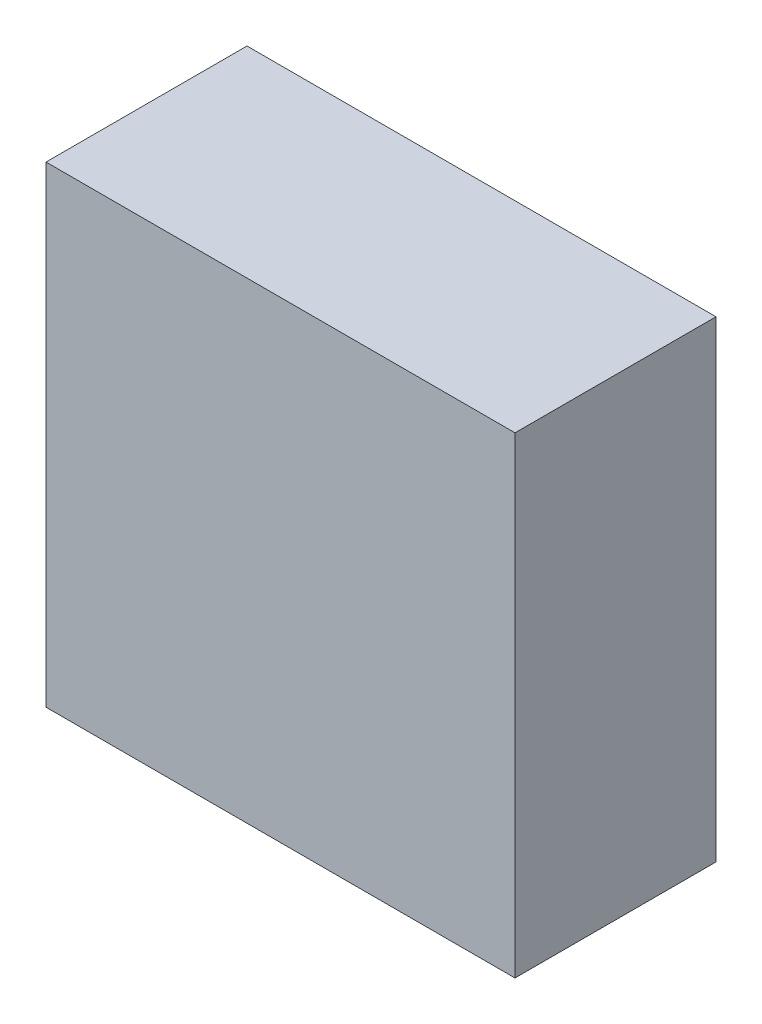
ISO-10303-21;
HEADER;
FILE_DESCRIPTION(('STEP AP214'),'2;1');
FILE_NAME('part.step','',(''),(''),'','','');
FILE_SCHEMA(('AUTOMOTIVE_DESIGN { 1 0 10303 214 1 1 1 1 }'));
ENDSEC;
DATA;
#1=APPLICATION_CONTEXT('core data for automotive mechanical design processes');
#2=APPLICATION_PROTOCOL_DEFINITION('international standard','automotive_design',2000,#1);
#3=PRODUCT_CONTEXT('',#1,'mechanical');
#4=PRODUCT('Part','Part','',(#3));
#5=PRODUCT_RELATED_PRODUCT_CATEGORY('part','',(#4));
#6=PRODUCT_DEFINITION_FORMATION('','',#4);
#7=PRODUCT_DEFINITION_CONTEXT('part definition',#1,'design');
#8=PRODUCT_DEFINITION('design','',#6,#7);
#9=PRODUCT_DEFINITION_SHAPE('','',#8);
#10=(LENGTH_UNIT() NAMED_UNIT(*) SI_UNIT(.MILLI.,.METRE.));
#11=(NAMED_UNIT(*) PLANE_ANGLE_UNIT() SI_UNIT($,.RADIAN.));
#12=(NAMED_UNIT(*) SI_UNIT($,.STERADIAN.) SOLID_ANGLE_UNIT());
#13=UNCERTAINTY_MEASURE_WITH_UNIT(LENGTH_MEASURE(1.E-05),#10,'distance_accuracy_value','');
#14=(GEOMETRIC_REPRESENTATION_CONTEXT(3) GLOBAL_UNCERTAINTY_ASSIGNED_CONTEXT((#13)) GLOBAL_UNIT_ASSIGNED_CONTEXT((#10,
#11,#12)) REPRESENTATION_CONTEXT('',''));
#15=CARTESIAN_POINT('',(0.,0.,0.));
#16=DIRECTION('',(0.,0.,1.));
#17=DIRECTION('',(1.,0.,0.));
#18=AXIS2_PLACEMENT_3D('',#15,#16,#17);
#19=CARTESIAN_POINT('',(-44.45,89.5,-19.05));
#20=DIRECTION('',(1.,0.,0.));
#21=DIRECTION('',(0.,0.,-1.));
#22=AXIS2_PLACEMENT_3D('',#19,#20,#21);
#23=PLANE('',#22);
#24=DIRECTION('',(0.,0.,1.));
#25=VECTOR('',#24,1.);
#26=CARTESIAN_POINT('',(-44.45,0.,-19.05));
#27=LINE('',#26,#25);
#28=CARTESIAN_POINT('',(-44.45,0.,-19.05));
#29=VERTEX_POINT('',#28);
#30=CARTESIAN_POINT('',(-44.45,0.,19.05));
#31=VERTEX_POINT('',#30);
#32=EDGE_CURVE('E106',#29,#31,#27,.T.);
#33=ORIENTED_EDGE('',*,*,#32,.T.);
#34=DIRECTION('',(0.,-1.,0.));
#35=VECTOR('',#34,1.);
#36=CARTESIAN_POINT('',(-44.45,89.5,19.05));
#37=LINE('',#36,#35);
#38=CARTESIAN_POINT('',(-44.45,89.5,19.05));
#39=VERTEX_POINT('',#38);
#40=EDGE_CURVE('E11',#39,#31,#37,.T.);
#41=ORIENTED_EDGE('',*,*,#40,.F.);
#42=DIRECTION('',(0.,0.,1.));
#43=VECTOR('',#42,1.);
#44=CARTESIAN_POINT('',(-44.45,89.5,-19.05));
#45=LINE('',#44,#43);
#46=CARTESIAN_POINT('',(-44.45,89.5,-19.05));
#47=VERTEX_POINT('',#46);
#48=EDGE_CURVE('E94',#47,#39,#45,.T.);
#49=ORIENTED_EDGE('',*,*,#48,.F.);
#50=DIRECTION('',(0.,-1.,0.));
#51=VECTOR('',#50,1.);
#52=CARTESIAN_POINT('',(-44.45,89.5,-19.05));
#53=LINE('',#52,#51);
#54=EDGE_CURVE('E102',#47,#29,#53,.T.);
#55=ORIENTED_EDGE('',*,*,#54,.T.);
#56=EDGE_LOOP('',(#33,#41,#49,#55));
#57=FACE_BOUND('',#56,.T.);
#58=ADVANCED_FACE('F43',(#57),#23,.F.);
#59=CARTESIAN_POINT('',(-44.45,89.5,19.05));
#60=DIRECTION('',(0.,0.,-1.));
#61=DIRECTION('',(-1.,0.,0.));
#62=AXIS2_PLACEMENT_3D('',#59,#60,#61);
#63=PLANE('',#62);
#64=DIRECTION('',(1.,0.,0.));
#65=VECTOR('',#64,1.);
#66=CARTESIAN_POINT('',(-44.45,0.,19.05));
#67=LINE('',#66,#65);
#68=CARTESIAN_POINT('',(44.45,0.,19.05));
#69=VERTEX_POINT('',#68);
#70=EDGE_CURVE('E98',#31,#69,#67,.T.);
#71=ORIENTED_EDGE('',*,*,#70,.T.);
#72=DIRECTION('',(0.,-1.,0.));
#73=VECTOR('',#72,1.);
#74=CARTESIAN_POINT('',(44.45,89.5,19.05));
#75=LINE('',#74,#73);
#76=CARTESIAN_POINT('',(44.45,89.5,19.05));
#77=VERTEX_POINT('',#76);
#78=EDGE_CURVE('E51',#77,#69,#75,.T.);
#79=ORIENTED_EDGE('',*,*,#78,.F.);
#80=DIRECTION('',(1.,0.,0.));
#81=VECTOR('',#80,1.);
#82=CARTESIAN_POINT('',(-44.45,89.5,19.05));
#83=LINE('',#82,#81);
#84=EDGE_CURVE('E89',#39,#77,#83,.T.);
#85=ORIENTED_EDGE('',*,*,#84,.F.);
#86=ORIENTED_EDGE('',*,*,#40,.T.);
#87=EDGE_LOOP('',(#71,#79,#85,#86));
#88=FACE_BOUND('',#87,.T.);
#89=ADVANCED_FACE('F97',(#88),#63,.F.);
#90=CARTESIAN_POINT('',(44.45,89.5,-19.05));
#91=DIRECTION('',(-1.,0.,0.));
#92=DIRECTION('',(0.,0.,1.));
#93=AXIS2_PLACEMENT_3D('',#90,#91,#92);
#94=PLANE('',#93);
#95=DIRECTION('',(0.,0.,-1.));
#96=VECTOR('',#95,1.);
#97=CARTESIAN_POINT('',(44.45,0.,-19.05));
#98=LINE('',#97,#96);
#99=CARTESIAN_POINT('',(44.45,0.,-19.05));
#100=VERTEX_POINT('',#99);
#101=EDGE_CURVE('E76',#69,#100,#98,.T.);
#102=ORIENTED_EDGE('',*,*,#101,.T.);
#103=DIRECTION('',(0.,-1.,0.));
#104=VECTOR('',#103,1.);
#105=CARTESIAN_POINT('',(44.45,89.5,-19.05));
#106=LINE('',#105,#104);
#107=CARTESIAN_POINT('',(44.45,89.5,-19.05));
#108=VERTEX_POINT('',#107);
#109=EDGE_CURVE('E99',#108,#100,#106,.T.);
#110=ORIENTED_EDGE('',*,*,#109,.F.);
#111=DIRECTION('',(0.,0.,-1.));
#112=VECTOR('',#111,1.);
#113=CARTESIAN_POINT('',(44.45,89.5,-19.05));
#114=LINE('',#113,#112);
#115=EDGE_CURVE('E92',#77,#108,#114,.T.);
#116=ORIENTED_EDGE('',*,*,#115,.F.);
#117=ORIENTED_EDGE('',*,*,#78,.T.);
#118=EDGE_LOOP('',(#102,#110,#116,#117));
#119=FACE_BOUND('',#118,.T.);
#120=ADVANCED_FACE('F100',(#119),#94,.F.);
#121=CARTESIAN_POINT('',(-44.45,89.5,-19.05));
#122=DIRECTION('',(0.,0.,1.));
#123=DIRECTION('',(1.,0.,0.));
#124=AXIS2_PLACEMENT_3D('',#121,#122,#123);
#125=PLANE('',#124);
#126=DIRECTION('',(-1.,0.,0.));
#127=VECTOR('',#126,1.);
#128=CARTESIAN_POINT('',(-44.45,0.,-19.05));
#129=LINE('',#128,#127);
#130=EDGE_CURVE('E82',#100,#29,#129,.T.);
#131=ORIENTED_EDGE('',*,*,#130,.T.);
#132=ORIENTED_EDGE('',*,*,#54,.F.);
#133=DIRECTION('',(-1.,0.,0.));
#134=VECTOR('',#133,1.);
#135=CARTESIAN_POINT('',(-44.45,89.5,-19.05));
#136=LINE('',#135,#134);
#137=EDGE_CURVE('E59',#108,#47,#136,.T.);
#138=ORIENTED_EDGE('',*,*,#137,.F.);
#139=ORIENTED_EDGE('',*,*,#109,.T.);
#140=EDGE_LOOP('',(#131,#132,#138,#139));
#141=FACE_BOUND('',#140,.T.);
#142=ADVANCED_FACE('F113',(#141),#125,.F.);
#143=CARTESIAN_POINT('',(0.,89.5,0.));
#144=DIRECTION('',(0.,1.,0.));
#145=DIRECTION('',(0.,0.,1.));
#146=AXIS2_PLACEMENT_3D('',#143,#144,#145);
#147=PLANE('',#146);
#148=ORIENTED_EDGE('',*,*,#48,.T.);
#149=ORIENTED_EDGE('',*,*,#84,.T.);
#150=ORIENTED_EDGE('',*,*,#115,.T.);
#151=ORIENTED_EDGE('',*,*,#137,.T.);
#152=EDGE_LOOP('',(#148,#149,#150,#151));
#153=FACE_BOUND('',#152,.T.);
#154=ADVANCED_FACE('F90',(#153),#147,.T.);
#155=CARTESIAN_POINT('',(0.,0.,0.));
#156=DIRECTION('',(0.,1.,0.));
#157=DIRECTION('',(0.,0.,1.));
#158=AXIS2_PLACEMENT_3D('',#155,#156,#157);
#159=PLANE('',#158);
#160=ORIENTED_EDGE('',*,*,#32,.F.);
#161=ORIENTED_EDGE('',*,*,#130,.F.);
#162=ORIENTED_EDGE('',*,*,#101,.F.);
#163=ORIENTED_EDGE('',*,*,#70,.F.);
#164=EDGE_LOOP('',(#160,#161,#162,#163));
#165=FACE_BOUND('',#164,.T.);
#166=ADVANCED_FACE('F116',(#165),#159,.F.);
#167=CLOSED_SHELL('',(#58,#89,#120,#142,#154,#166));
#168=MANIFOLD_SOLID_BREP('B2',#167);
#169=ADVANCED_BREP_SHAPE_REPRESENTATION('',(#18,#168),#14);
#170=SHAPE_DEFINITION_REPRESENTATION(#9,#169);
ENDSEC;
END-ISO-10303-21;
